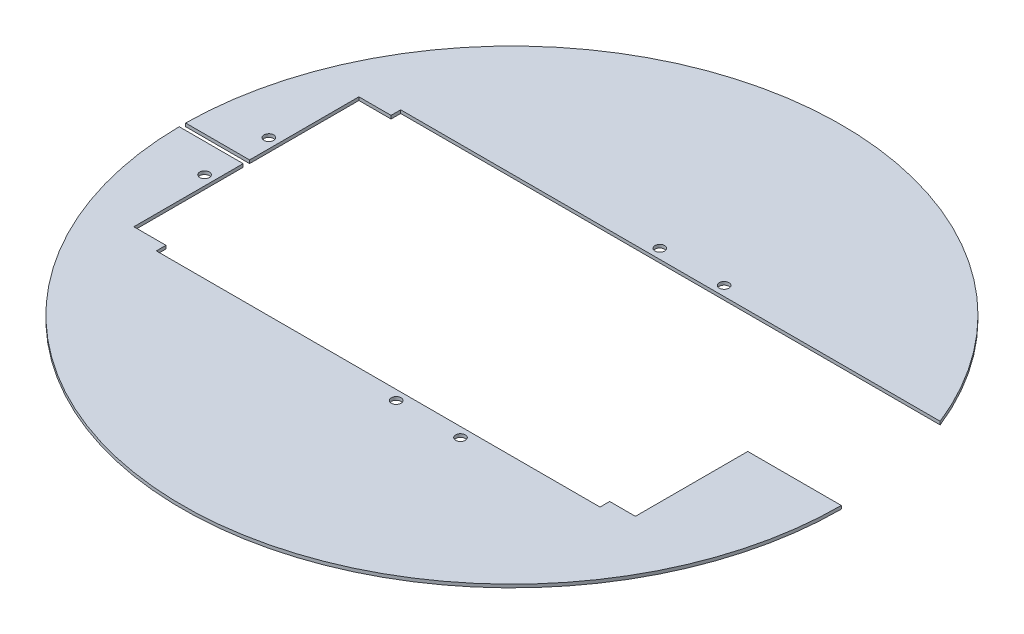
ISO-10303-21;
HEADER;
FILE_DESCRIPTION(('STEP AP214'),'2;1');
FILE_NAME('part.step','',(''),(''),'','','');
FILE_SCHEMA(('AUTOMOTIVE_DESIGN { 1 0 10303 214 1 1 1 1 }'));
ENDSEC;
DATA;
#1=APPLICATION_CONTEXT('core data for automotive mechanical design processes');
#2=APPLICATION_PROTOCOL_DEFINITION('international standard','automotive_design',2000,#1);
#3=PRODUCT_CONTEXT('',#1,'mechanical');
#4=PRODUCT('Part','Part','',(#3));
#5=PRODUCT_RELATED_PRODUCT_CATEGORY('part','',(#4));
#6=PRODUCT_DEFINITION_FORMATION('','',#4);
#7=PRODUCT_DEFINITION_CONTEXT('part definition',#1,'design');
#8=PRODUCT_DEFINITION('design','',#6,#7);
#9=PRODUCT_DEFINITION_SHAPE('','',#8);
#10=(LENGTH_UNIT() NAMED_UNIT(*) SI_UNIT(.MILLI.,.METRE.));
#11=(NAMED_UNIT(*) PLANE_ANGLE_UNIT() SI_UNIT($,.RADIAN.));
#12=(NAMED_UNIT(*) SI_UNIT($,.STERADIAN.) SOLID_ANGLE_UNIT());
#13=UNCERTAINTY_MEASURE_WITH_UNIT(LENGTH_MEASURE(1.E-05),#10,'distance_accuracy_value','');
#14=(GEOMETRIC_REPRESENTATION_CONTEXT(3) GLOBAL_UNCERTAINTY_ASSIGNED_CONTEXT((#13)) GLOBAL_UNIT_ASSIGNED_CONTEXT((#10,
#11,#12)) REPRESENTATION_CONTEXT('',''));
#15=CARTESIAN_POINT('',(0.,0.,0.));
#16=DIRECTION('',(0.,0.,1.));
#17=DIRECTION('',(1.,0.,0.));
#18=AXIS2_PLACEMENT_3D('',#15,#16,#17);
#19=CARTESIAN_POINT('',(-82.6,1.,-35.));
#20=DIRECTION('',(1.,0.,0.));
#21=DIRECTION('',(0.,0.,-1.));
#22=AXIS2_PLACEMENT_3D('',#19,#20,#21);
#23=PLANE('',#22);
#24=DIRECTION('',(0.,1.,0.));
#25=VECTOR('',#24,1.);
#26=CARTESIAN_POINT('',(-82.6,0.,1.));
#27=LINE('',#26,#25);
#28=CARTESIAN_POINT('',(-82.6,0.,1.));
#29=VERTEX_POINT('',#28);
#30=CARTESIAN_POINT('',(-82.6,1.,1.00000000000001));
#31=VERTEX_POINT('',#30);
#32=EDGE_CURVE('E78',#29,#31,#27,.T.);
#33=ORIENTED_EDGE('',*,*,#32,.T.);
#34=DIRECTION('',(0.,0.,1.));
#35=VECTOR('',#34,1.);
#36=CARTESIAN_POINT('',(-82.6,1.,-35.));
#37=LINE('',#36,#35);
#38=CARTESIAN_POINT('',(-82.6,1.,35.));
#39=VERTEX_POINT('',#38);
#40=EDGE_CURVE('E122',#31,#39,#37,.T.);
#41=ORIENTED_EDGE('',*,*,#40,.T.);
#42=DIRECTION('',(0.,-1.,0.));
#43=VECTOR('',#42,1.);
#44=CARTESIAN_POINT('',(-82.6,1.,35.));
#45=LINE('',#44,#43);
#46=CARTESIAN_POINT('',(-82.6,0.,35.));
#47=VERTEX_POINT('',#46);
#48=EDGE_CURVE('E125',#39,#47,#45,.T.);
#49=ORIENTED_EDGE('',*,*,#48,.T.);
#50=DIRECTION('',(0.,0.,1.));
#51=VECTOR('',#50,1.);
#52=CARTESIAN_POINT('',(-82.6,0.,-35.));
#53=LINE('',#52,#51);
#54=EDGE_CURVE('E50',#29,#47,#53,.T.);
#55=ORIENTED_EDGE('',*,*,#54,.F.);
#56=EDGE_LOOP('',(#33,#41,#49,#55));
#57=FACE_BOUND('',#56,.T.);
#58=ADVANCED_FACE('F46',(#57),#23,.T.);
#59=CARTESIAN_POINT('',(0.,1.,0.));
#60=DIRECTION('',(0.,1.,0.));
#61=DIRECTION('',(0.,0.,1.));
#62=AXIS2_PLACEMENT_3D('',#59,#60,#61);
#63=PLANE('',#62);
#64=CARTESIAN_POINT('',(25.,1.,41.));
#65=DIRECTION('',(0.,1.,0.));
#66=DIRECTION('',(0.,0.,1.));
#67=AXIS2_PLACEMENT_3D('',#64,#65,#66);
#68=CIRCLE('',#67,1.50000000000001);
#69=CARTESIAN_POINT('',(25.,1.,42.5));
#70=VERTEX_POINT('',#69);
#71=EDGE_CURVE('E270',#70,#70,#68,.T.);
#72=ORIENTED_EDGE('',*,*,#71,.F.);
#73=EDGE_LOOP('',(#72));
#74=FACE_BOUND('',#73,.T.);
#75=CARTESIAN_POINT('',(5.,1.,41.));
#76=DIRECTION('',(0.,1.,0.));
#77=DIRECTION('',(0.,0.,-1.));
#78=AXIS2_PLACEMENT_3D('',#75,#76,#77);
#79=CIRCLE('',#78,1.5);
#80=CARTESIAN_POINT('',(5.,1.,39.5));
#81=VERTEX_POINT('',#80);
#82=EDGE_CURVE('E261',#81,#81,#79,.T.);
#83=ORIENTED_EDGE('',*,*,#82,.F.);
#84=EDGE_LOOP('',(#83));
#85=FACE_BOUND('',#84,.T.);
#86=CARTESIAN_POINT('',(-85.6,1.,10.));
#87=DIRECTION('',(0.,1.,0.));
#88=DIRECTION('',(0.,0.,-1.));
#89=AXIS2_PLACEMENT_3D('',#86,#87,#88);
#90=CIRCLE('',#89,1.5);
#91=CARTESIAN_POINT('',(-85.6,1.,8.5));
#92=VERTEX_POINT('',#91);
#93=EDGE_CURVE('E262',#92,#92,#90,.T.);
#94=ORIENTED_EDGE('',*,*,#93,.F.);
#95=EDGE_LOOP('',(#94));
#96=FACE_BOUND('',#95,.T.);
#97=DIRECTION('',(1.,0.,0.));
#98=VECTOR('',#97,1.);
#99=CARTESIAN_POINT('',(73.4,1.,0.05));
#100=LINE('',#99,#98);
#101=CARTESIAN_POINT('',(73.4,1.,0.05));
#102=VERTEX_POINT('',#101);
#103=CARTESIAN_POINT('',(102.499987804877,1.,0.0499999999999998));
#104=VERTEX_POINT('',#103);
#105=EDGE_CURVE('E56',#102,#104,#100,.T.);
#106=ORIENTED_EDGE('',*,*,#105,.F.);
#107=DIRECTION('',(0.,0.,-1.));
#108=VECTOR('',#107,1.);
#109=CARTESIAN_POINT('',(73.4,1.,-35.));
#110=LINE('',#109,#108);
#111=CARTESIAN_POINT('',(73.4,1.,35.));
#112=VERTEX_POINT('',#111);
#113=EDGE_CURVE('E161',#112,#102,#110,.T.);
#114=ORIENTED_EDGE('',*,*,#113,.F.);
#115=DIRECTION('',(1.,0.,0.));
#116=VECTOR('',#115,1.);
#117=CARTESIAN_POINT('',(73.4,1.,35.));
#118=LINE('',#117,#116);
#119=CARTESIAN_POINT('',(65.4,1.,35.));
#120=VERTEX_POINT('',#119);
#121=EDGE_CURVE('E199',#120,#112,#118,.T.);
#122=ORIENTED_EDGE('',*,*,#121,.F.);
#123=DIRECTION('',(0.,0.,-1.));
#124=VECTOR('',#123,1.);
#125=CARTESIAN_POINT('',(65.4,1.,38.));
#126=LINE('',#125,#124);
#127=CARTESIAN_POINT('',(65.4,1.,38.));
#128=VERTEX_POINT('',#127);
#129=EDGE_CURVE('E202',#128,#120,#126,.T.);
#130=ORIENTED_EDGE('',*,*,#129,.F.);
#131=DIRECTION('',(1.,0.,0.));
#132=VECTOR('',#131,1.);
#133=CARTESIAN_POINT('',(-72.6,1.,38.));
#134=LINE('',#133,#132);
#135=CARTESIAN_POINT('',(-72.6,1.,38.));
#136=VERTEX_POINT('',#135);
#137=EDGE_CURVE('E204',#136,#128,#134,.T.);
#138=ORIENTED_EDGE('',*,*,#137,.F.);
#139=DIRECTION('',(0.,0.,1.));
#140=VECTOR('',#139,1.);
#141=CARTESIAN_POINT('',(-72.6,1.,35.));
#142=LINE('',#141,#140);
#143=CARTESIAN_POINT('',(-72.6,1.,35.));
#144=VERTEX_POINT('',#143);
#145=EDGE_CURVE('E141',#144,#136,#142,.T.);
#146=ORIENTED_EDGE('',*,*,#145,.F.);
#147=DIRECTION('',(1.,0.,0.));
#148=VECTOR('',#147,1.);
#149=CARTESIAN_POINT('',(-82.6,1.,35.));
#150=LINE('',#149,#148);
#151=EDGE_CURVE('E132',#39,#144,#150,.T.);
#152=ORIENTED_EDGE('',*,*,#151,.F.);
#153=ORIENTED_EDGE('',*,*,#40,.F.);
#154=DIRECTION('',(1.,0.,0.));
#155=VECTOR('',#154,1.);
#156=CARTESIAN_POINT('',(-82.6,1.,1.));
#157=LINE('',#156,#155);
#158=CARTESIAN_POINT('',(-102.495121835139,1.,1.));
#159=VERTEX_POINT('',#158);
#160=EDGE_CURVE('E12',#159,#31,#157,.T.);
#161=ORIENTED_EDGE('',*,*,#160,.F.);
#162=CARTESIAN_POINT('',(0.,1.,0.));
#163=DIRECTION('',(0.,1.,0.));
#164=DIRECTION('',(0.,0.,1.));
#165=AXIS2_PLACEMENT_3D('',#162,#163,#164);
#166=CIRCLE('',#165,102.5);
#167=EDGE_CURVE('E136',#159,#104,#166,.T.);
#168=ORIENTED_EDGE('',*,*,#167,.T.);
#169=EDGE_LOOP('',(#106,#114,#122,#130,#138,#146,#152,#153,#161,#168));
#170=FACE_BOUND('',#169,.T.);
#171=ADVANCED_FACE('F48',(#74,#85,#96,#170),#63,.T.);
#172=CARTESIAN_POINT('',(0.,0.,0.));
#173=DIRECTION('',(0.,1.,0.));
#174=DIRECTION('',(0.,0.,1.));
#175=AXIS2_PLACEMENT_3D('',#172,#173,#174);
#176=PLANE('',#175);
#177=CARTESIAN_POINT('',(25.,0.,41.));
#178=DIRECTION('',(0.,1.,0.));
#179=DIRECTION('',(0.,0.,1.));
#180=AXIS2_PLACEMENT_3D('',#177,#178,#179);
#181=CIRCLE('',#180,1.50000000000001);
#182=CARTESIAN_POINT('',(25.,0.,42.5));
#183=VERTEX_POINT('',#182);
#184=EDGE_CURVE('E153',#183,#183,#181,.T.);
#185=ORIENTED_EDGE('',*,*,#184,.T.);
#186=EDGE_LOOP('',(#185));
#187=FACE_BOUND('',#186,.T.);
#188=CARTESIAN_POINT('',(5.,0.,41.));
#189=DIRECTION('',(0.,1.,0.));
#190=DIRECTION('',(0.,0.,-1.));
#191=AXIS2_PLACEMENT_3D('',#188,#189,#190);
#192=CIRCLE('',#191,1.5);
#193=CARTESIAN_POINT('',(5.,0.,39.5));
#194=VERTEX_POINT('',#193);
#195=EDGE_CURVE('E256',#194,#194,#192,.T.);
#196=ORIENTED_EDGE('',*,*,#195,.T.);
#197=EDGE_LOOP('',(#196));
#198=FACE_BOUND('',#197,.T.);
#199=CARTESIAN_POINT('',(-85.6,0.,10.));
#200=DIRECTION('',(0.,1.,0.));
#201=DIRECTION('',(0.,0.,-1.));
#202=AXIS2_PLACEMENT_3D('',#199,#200,#201);
#203=CIRCLE('',#202,1.5);
#204=CARTESIAN_POINT('',(-85.6,0.,8.5));
#205=VERTEX_POINT('',#204);
#206=EDGE_CURVE('E259',#205,#205,#203,.T.);
#207=ORIENTED_EDGE('',*,*,#206,.T.);
#208=EDGE_LOOP('',(#207));
#209=FACE_BOUND('',#208,.T.);
#210=DIRECTION('',(0.,0.,-1.));
#211=VECTOR('',#210,1.);
#212=CARTESIAN_POINT('',(73.4,0.,-35.));
#213=LINE('',#212,#211);
#214=CARTESIAN_POINT('',(73.4,0.,35.));
#215=VERTEX_POINT('',#214);
#216=CARTESIAN_POINT('',(73.4,0.,0.0500000000000014));
#217=VERTEX_POINT('',#216);
#218=EDGE_CURVE('E165',#215,#217,#213,.T.);
#219=ORIENTED_EDGE('',*,*,#218,.T.);
#220=DIRECTION('',(1.,0.,0.));
#221=VECTOR('',#220,1.);
#222=CARTESIAN_POINT('',(73.4,0.,0.05));
#223=LINE('',#222,#221);
#224=CARTESIAN_POINT('',(102.499987804877,0.,0.0499999999999998));
#225=VERTEX_POINT('',#224);
#226=EDGE_CURVE('E157',#217,#225,#223,.T.);
#227=ORIENTED_EDGE('',*,*,#226,.T.);
#228=CARTESIAN_POINT('',(0.,0.,0.));
#229=DIRECTION('',(0.,1.,0.));
#230=DIRECTION('',(0.,0.,1.));
#231=AXIS2_PLACEMENT_3D('',#228,#229,#230);
#232=CIRCLE('',#231,102.5);
#233=CARTESIAN_POINT('',(-102.495121835139,0.,1.));
#234=VERTEX_POINT('',#233);
#235=EDGE_CURVE('E152',#234,#225,#232,.T.);
#236=ORIENTED_EDGE('',*,*,#235,.F.);
#237=DIRECTION('',(1.,0.,0.));
#238=VECTOR('',#237,1.);
#239=CARTESIAN_POINT('',(-82.6,0.,1.));
#240=LINE('',#239,#238);
#241=EDGE_CURVE('E155',#234,#29,#240,.T.);
#242=ORIENTED_EDGE('',*,*,#241,.T.);
#243=ORIENTED_EDGE('',*,*,#54,.T.);
#244=DIRECTION('',(1.,0.,0.));
#245=VECTOR('',#244,1.);
#246=CARTESIAN_POINT('',(-82.6,0.,35.));
#247=LINE('',#246,#245);
#248=CARTESIAN_POINT('',(-72.6,0.,35.));
#249=VERTEX_POINT('',#248);
#250=EDGE_CURVE('E135',#47,#249,#247,.T.);
#251=ORIENTED_EDGE('',*,*,#250,.T.);
#252=DIRECTION('',(0.,0.,1.));
#253=VECTOR('',#252,1.);
#254=CARTESIAN_POINT('',(-72.6,0.,35.));
#255=LINE('',#254,#253);
#256=CARTESIAN_POINT('',(-72.6,0.,38.));
#257=VERTEX_POINT('',#256);
#258=EDGE_CURVE('E192',#249,#257,#255,.T.);
#259=ORIENTED_EDGE('',*,*,#258,.T.);
#260=DIRECTION('',(1.,0.,0.));
#261=VECTOR('',#260,1.);
#262=CARTESIAN_POINT('',(-72.6,0.,38.));
#263=LINE('',#262,#261);
#264=CARTESIAN_POINT('',(65.4,0.,38.));
#265=VERTEX_POINT('',#264);
#266=EDGE_CURVE('E195',#257,#265,#263,.T.);
#267=ORIENTED_EDGE('',*,*,#266,.T.);
#268=DIRECTION('',(0.,0.,-1.));
#269=VECTOR('',#268,1.);
#270=CARTESIAN_POINT('',(65.4,0.,38.));
#271=LINE('',#270,#269);
#272=CARTESIAN_POINT('',(65.4,0.,35.));
#273=VERTEX_POINT('',#272);
#274=EDGE_CURVE('E218',#265,#273,#271,.T.);
#275=ORIENTED_EDGE('',*,*,#274,.T.);
#276=DIRECTION('',(1.,0.,0.));
#277=VECTOR('',#276,1.);
#278=CARTESIAN_POINT('',(73.4,0.,35.));
#279=LINE('',#278,#277);
#280=EDGE_CURVE('E170',#273,#215,#279,.T.);
#281=ORIENTED_EDGE('',*,*,#280,.T.);
#282=EDGE_LOOP('',(#219,#227,#236,#242,#243,#251,#259,#267,#275,#281));
#283=FACE_BOUND('',#282,.T.);
#284=ADVANCED_FACE('F177',(#187,#198,#209,#283),#176,.F.);
#285=CARTESIAN_POINT('',(0.,1.,0.));
#286=DIRECTION('',(0.,-1.,0.));
#287=DIRECTION('',(0.,0.,-1.));
#288=AXIS2_PLACEMENT_3D('',#285,#286,#287);
#289=CYLINDRICAL_SURFACE('',#288,102.5);
#290=ORIENTED_EDGE('',*,*,#235,.T.);
#291=DIRECTION('',(0.,-1.,0.));
#292=VECTOR('',#291,1.);
#293=CARTESIAN_POINT('',(102.499987804877,1.,0.0499999999999998));
#294=LINE('',#293,#292);
#295=EDGE_CURVE('E145',#225,#104,#294,.F.);
#296=ORIENTED_EDGE('',*,*,#295,.T.);
#297=ORIENTED_EDGE('',*,*,#167,.F.);
#298=DIRECTION('',(0.,-1.,0.));
#299=VECTOR('',#298,1.);
#300=CARTESIAN_POINT('',(-102.495121835139,1.,1.));
#301=LINE('',#300,#299);
#302=EDGE_CURVE('E64',#159,#234,#301,.T.);
#303=ORIENTED_EDGE('',*,*,#302,.T.);
#304=EDGE_LOOP('',(#290,#296,#297,#303));
#305=FACE_BOUND('',#304,.T.);
#306=ADVANCED_FACE('F191',(#305),#289,.T.);
#307=CARTESIAN_POINT('',(-82.6,1.,35.));
#308=DIRECTION('',(0.,0.,-1.));
#309=DIRECTION('',(-1.,0.,0.));
#310=AXIS2_PLACEMENT_3D('',#307,#308,#309);
#311=PLANE('',#310);
#312=ORIENTED_EDGE('',*,*,#250,.F.);
#313=ORIENTED_EDGE('',*,*,#48,.F.);
#314=ORIENTED_EDGE('',*,*,#151,.T.);
#315=DIRECTION('',(0.,-1.,0.));
#316=VECTOR('',#315,1.);
#317=CARTESIAN_POINT('',(-72.6,1.,35.));
#318=LINE('',#317,#316);
#319=EDGE_CURVE('E142',#144,#249,#318,.T.);
#320=ORIENTED_EDGE('',*,*,#319,.T.);
#321=EDGE_LOOP('',(#312,#313,#314,#320));
#322=FACE_BOUND('',#321,.T.);
#323=ADVANCED_FACE('F131',(#322),#311,.T.);
#324=CARTESIAN_POINT('',(-72.6,1.,35.));
#325=DIRECTION('',(1.,0.,0.));
#326=DIRECTION('',(0.,0.,-1.));
#327=AXIS2_PLACEMENT_3D('',#324,#325,#326);
#328=PLANE('',#327);
#329=ORIENTED_EDGE('',*,*,#258,.F.);
#330=ORIENTED_EDGE('',*,*,#319,.F.);
#331=ORIENTED_EDGE('',*,*,#145,.T.);
#332=DIRECTION('',(0.,-1.,0.));
#333=VECTOR('',#332,1.);
#334=CARTESIAN_POINT('',(-72.6,1.,38.));
#335=LINE('',#334,#333);
#336=EDGE_CURVE('E205',#136,#257,#335,.T.);
#337=ORIENTED_EDGE('',*,*,#336,.T.);
#338=EDGE_LOOP('',(#329,#330,#331,#337));
#339=FACE_BOUND('',#338,.T.);
#340=ADVANCED_FACE('F296',(#339),#328,.T.);
#341=CARTESIAN_POINT('',(-72.6,1.,38.));
#342=DIRECTION('',(0.,0.,-1.));
#343=DIRECTION('',(-1.,0.,0.));
#344=AXIS2_PLACEMENT_3D('',#341,#342,#343);
#345=PLANE('',#344);
#346=ORIENTED_EDGE('',*,*,#266,.F.);
#347=ORIENTED_EDGE('',*,*,#336,.F.);
#348=ORIENTED_EDGE('',*,*,#137,.T.);
#349=DIRECTION('',(0.,-1.,0.));
#350=VECTOR('',#349,1.);
#351=CARTESIAN_POINT('',(65.4,1.,38.));
#352=LINE('',#351,#350);
#353=EDGE_CURVE('E203',#128,#265,#352,.T.);
#354=ORIENTED_EDGE('',*,*,#353,.T.);
#355=EDGE_LOOP('',(#346,#347,#348,#354));
#356=FACE_BOUND('',#355,.T.);
#357=ADVANCED_FACE('F221',(#356),#345,.T.);
#358=CARTESIAN_POINT('',(65.4,1.,38.));
#359=DIRECTION('',(-1.,0.,0.));
#360=DIRECTION('',(0.,0.,1.));
#361=AXIS2_PLACEMENT_3D('',#358,#359,#360);
#362=PLANE('',#361);
#363=ORIENTED_EDGE('',*,*,#274,.F.);
#364=ORIENTED_EDGE('',*,*,#353,.F.);
#365=ORIENTED_EDGE('',*,*,#129,.T.);
#366=DIRECTION('',(0.,-1.,0.));
#367=VECTOR('',#366,1.);
#368=CARTESIAN_POINT('',(65.4,1.,35.));
#369=LINE('',#368,#367);
#370=EDGE_CURVE('E201',#120,#273,#369,.T.);
#371=ORIENTED_EDGE('',*,*,#370,.T.);
#372=EDGE_LOOP('',(#363,#364,#365,#371));
#373=FACE_BOUND('',#372,.T.);
#374=ADVANCED_FACE('F224',(#373),#362,.T.);
#375=CARTESIAN_POINT('',(73.4,1.,35.));
#376=DIRECTION('',(0.,0.,-1.));
#377=DIRECTION('',(-1.,0.,0.));
#378=AXIS2_PLACEMENT_3D('',#375,#376,#377);
#379=PLANE('',#378);
#380=ORIENTED_EDGE('',*,*,#280,.F.);
#381=ORIENTED_EDGE('',*,*,#370,.F.);
#382=ORIENTED_EDGE('',*,*,#121,.T.);
#383=DIRECTION('',(0.,-1.,0.));
#384=VECTOR('',#383,1.);
#385=CARTESIAN_POINT('',(73.4,1.,35.));
#386=LINE('',#385,#384);
#387=EDGE_CURVE('E172',#112,#215,#386,.T.);
#388=ORIENTED_EDGE('',*,*,#387,.T.);
#389=EDGE_LOOP('',(#380,#381,#382,#388));
#390=FACE_BOUND('',#389,.T.);
#391=ADVANCED_FACE('F227',(#390),#379,.T.);
#392=CARTESIAN_POINT('',(73.4,1.,-35.));
#393=DIRECTION('',(-1.,0.,0.));
#394=DIRECTION('',(0.,0.,1.));
#395=AXIS2_PLACEMENT_3D('',#392,#393,#394);
#396=PLANE('',#395);
#397=DIRECTION('',(0.,1.,0.));
#398=VECTOR('',#397,1.);
#399=CARTESIAN_POINT('',(73.4,0.,0.05));
#400=LINE('',#399,#398);
#401=EDGE_CURVE('E158',#217,#102,#400,.T.);
#402=ORIENTED_EDGE('',*,*,#401,.F.);
#403=ORIENTED_EDGE('',*,*,#218,.F.);
#404=ORIENTED_EDGE('',*,*,#387,.F.);
#405=ORIENTED_EDGE('',*,*,#113,.T.);
#406=EDGE_LOOP('',(#402,#403,#404,#405));
#407=FACE_BOUND('',#406,.T.);
#408=ADVANCED_FACE('F184',(#407),#396,.T.);
#409=CARTESIAN_POINT('',(73.4,0.,0.05));
#410=DIRECTION('',(0.,0.,1.));
#411=DIRECTION('',(1.,0.,0.));
#412=AXIS2_PLACEMENT_3D('',#409,#410,#411);
#413=PLANE('',#412);
#414=ORIENTED_EDGE('',*,*,#226,.F.);
#415=ORIENTED_EDGE('',*,*,#401,.T.);
#416=ORIENTED_EDGE('',*,*,#105,.T.);
#417=ORIENTED_EDGE('',*,*,#295,.F.);
#418=EDGE_LOOP('',(#414,#415,#416,#417));
#419=FACE_BOUND('',#418,.T.);
#420=ADVANCED_FACE('F187',(#419),#413,.F.);
#421=CARTESIAN_POINT('',(-82.6,0.,1.));
#422=DIRECTION('',(0.,0.,1.));
#423=DIRECTION('',(1.,0.,0.));
#424=AXIS2_PLACEMENT_3D('',#421,#422,#423);
#425=PLANE('',#424);
#426=ORIENTED_EDGE('',*,*,#160,.T.);
#427=ORIENTED_EDGE('',*,*,#32,.F.);
#428=ORIENTED_EDGE('',*,*,#241,.F.);
#429=ORIENTED_EDGE('',*,*,#302,.F.);
#430=EDGE_LOOP('',(#426,#427,#428,#429));
#431=FACE_BOUND('',#430,.T.);
#432=ADVANCED_FACE('F284',(#431),#425,.F.);
#433=CARTESIAN_POINT('',(-85.6,0.,10.));
#434=DIRECTION('',(0.,1.,0.));
#435=DIRECTION('',(0.,0.,1.));
#436=AXIS2_PLACEMENT_3D('',#433,#434,#435);
#437=CYLINDRICAL_SURFACE('',#436,1.5);
#438=ORIENTED_EDGE('',*,*,#206,.F.);
#439=EDGE_LOOP('',(#438));
#440=FACE_BOUND('',#439,.T.);
#441=ORIENTED_EDGE('',*,*,#93,.T.);
#442=EDGE_LOOP('',(#441));
#443=FACE_BOUND('',#442,.T.);
#444=ADVANCED_FACE('F281',(#440,#443),#437,.F.);
#445=CARTESIAN_POINT('',(5.,0.,41.));
#446=DIRECTION('',(0.,1.,0.));
#447=DIRECTION('',(0.,0.,1.));
#448=AXIS2_PLACEMENT_3D('',#445,#446,#447);
#449=CYLINDRICAL_SURFACE('',#448,1.5);
#450=ORIENTED_EDGE('',*,*,#195,.F.);
#451=EDGE_LOOP('',(#450));
#452=FACE_BOUND('',#451,.T.);
#453=ORIENTED_EDGE('',*,*,#82,.T.);
#454=EDGE_LOOP('',(#453));
#455=FACE_BOUND('',#454,.T.);
#456=ADVANCED_FACE('F283',(#452,#455),#449,.F.);
#457=CARTESIAN_POINT('',(25.,0.,41.));
#458=DIRECTION('',(0.,1.,0.));
#459=DIRECTION('',(0.,0.,1.));
#460=AXIS2_PLACEMENT_3D('',#457,#458,#459);
#461=CYLINDRICAL_SURFACE('',#460,1.50000000000001);
#462=ORIENTED_EDGE('',*,*,#184,.F.);
#463=EDGE_LOOP('',(#462));
#464=FACE_BOUND('',#463,.T.);
#465=ORIENTED_EDGE('',*,*,#71,.T.);
#466=EDGE_LOOP('',(#465));
#467=FACE_BOUND('',#466,.T.);
#468=ADVANCED_FACE('F275',(#464,#467),#461,.F.);
#469=CLOSED_SHELL('',(#58,#171,#284,#306,#323,#340,#357,#374,#391,#408,#420,#432,#444,#456,#468));
#470=MANIFOLD_SOLID_BREP('B2',#469);
#471=CARTESIAN_POINT('',(-72.6,1.,-35.));
#472=DIRECTION('',(1.,0.,0.));
#473=DIRECTION('',(0.,0.,-1.));
#474=AXIS2_PLACEMENT_3D('',#471,#472,#473);
#475=PLANE('',#474);
#476=DIRECTION('',(0.,0.,1.));
#477=VECTOR('',#476,1.);
#478=CARTESIAN_POINT('',(-72.6,0.,-35.));
#479=LINE('',#478,#477);
#480=CARTESIAN_POINT('',(-72.6,0.,-38.));
#481=VERTEX_POINT('',#480);
#482=CARTESIAN_POINT('',(-72.6,0.,-35.));
#483=VERTEX_POINT('',#482);
#484=EDGE_CURVE('E451',#481,#483,#479,.T.);
#485=ORIENTED_EDGE('',*,*,#484,.F.);
#486=DIRECTION('',(0.,-1.,0.));
#487=VECTOR('',#486,1.);
#488=CARTESIAN_POINT('',(-72.6,1.,-38.));
#489=LINE('',#488,#487);
#490=CARTESIAN_POINT('',(-72.6,1.,-38.));
#491=VERTEX_POINT('',#490);
#492=EDGE_CURVE('E446',#491,#481,#489,.T.);
#493=ORIENTED_EDGE('',*,*,#492,.F.);
#494=DIRECTION('',(0.,0.,1.));
#495=VECTOR('',#494,1.);
#496=CARTESIAN_POINT('',(-72.6,1.,-35.));
#497=LINE('',#496,#495);
#498=CARTESIAN_POINT('',(-72.6,1.,-35.));
#499=VERTEX_POINT('',#498);
#500=EDGE_CURVE('E472',#491,#499,#497,.T.);
#501=ORIENTED_EDGE('',*,*,#500,.T.);
#502=DIRECTION('',(0.,-1.,0.));
#503=VECTOR('',#502,1.);
#504=CARTESIAN_POINT('',(-72.6,1.,-35.));
#505=LINE('',#504,#503);
#506=EDGE_CURVE('E467',#499,#483,#505,.T.);
#507=ORIENTED_EDGE('',*,*,#506,.T.);
#508=EDGE_LOOP('',(#485,#493,#501,#507));
#509=FACE_BOUND('',#508,.T.);
#510=ADVANCED_FACE('F388',(#509),#475,.T.);
#511=CARTESIAN_POINT('',(-72.6,1.,-38.));
#512=DIRECTION('',(0.,0.,1.));
#513=DIRECTION('',(1.,0.,0.));
#514=AXIS2_PLACEMENT_3D('',#511,#512,#513);
#515=PLANE('',#514);
#516=DIRECTION('',(-1.,0.,0.));
#517=VECTOR('',#516,1.);
#518=CARTESIAN_POINT('',(-72.6,0.,-38.));
#519=LINE('',#518,#517);
#520=CARTESIAN_POINT('',(95.1958507499145,0.,-38.));
#521=VERTEX_POINT('',#520);
#522=EDGE_CURVE('E441',#521,#481,#519,.T.);
#523=ORIENTED_EDGE('',*,*,#522,.F.);
#524=DIRECTION('',(0.,-1.,0.));
#525=VECTOR('',#524,1.);
#526=CARTESIAN_POINT('',(95.1958507499145,1.,-38.));
#527=LINE('',#526,#525);
#528=CARTESIAN_POINT('',(95.1958507499145,1.,-38.));
#529=VERTEX_POINT('',#528);
#530=EDGE_CURVE('E444',#529,#521,#527,.T.);
#531=ORIENTED_EDGE('',*,*,#530,.F.);
#532=DIRECTION('',(-1.,0.,0.));
#533=VECTOR('',#532,1.);
#534=CARTESIAN_POINT('',(-72.6,1.,-38.));
#535=LINE('',#534,#533);
#536=EDGE_CURVE('E402',#529,#491,#535,.T.);
#537=ORIENTED_EDGE('',*,*,#536,.T.);
#538=ORIENTED_EDGE('',*,*,#492,.T.);
#539=EDGE_LOOP('',(#523,#531,#537,#538));
#540=FACE_BOUND('',#539,.T.);
#541=ADVANCED_FACE('F443',(#540),#515,.T.);
#542=CARTESIAN_POINT('',(-82.6,1.,-35.));
#543=DIRECTION('',(0.,0.,1.));
#544=DIRECTION('',(1.,0.,0.));
#545=AXIS2_PLACEMENT_3D('',#542,#543,#544);
#546=PLANE('',#545);
#547=DIRECTION('',(-1.,0.,0.));
#548=VECTOR('',#547,1.);
#549=CARTESIAN_POINT('',(-82.6,0.,-35.));
#550=LINE('',#549,#548);
#551=CARTESIAN_POINT('',(-82.6,0.,-35.));
#552=VERTEX_POINT('',#551);
#553=EDGE_CURVE('E476',#483,#552,#550,.T.);
#554=ORIENTED_EDGE('',*,*,#553,.F.);
#555=ORIENTED_EDGE('',*,*,#506,.F.);
#556=DIRECTION('',(-1.,0.,0.));
#557=VECTOR('',#556,1.);
#558=CARTESIAN_POINT('',(-82.6,1.,-35.));
#559=LINE('',#558,#557);
#560=CARTESIAN_POINT('',(-82.6,1.,-35.));
#561=VERTEX_POINT('',#560);
#562=EDGE_CURVE('E473',#499,#561,#559,.T.);
#563=ORIENTED_EDGE('',*,*,#562,.T.);
#564=DIRECTION('',(0.,-1.,0.));
#565=VECTOR('',#564,1.);
#566=CARTESIAN_POINT('',(-82.6,1.,-35.));
#567=LINE('',#566,#565);
#568=EDGE_CURVE('E461',#561,#552,#567,.T.);
#569=ORIENTED_EDGE('',*,*,#568,.T.);
#570=EDGE_LOOP('',(#554,#555,#563,#569));
#571=FACE_BOUND('',#570,.T.);
#572=ADVANCED_FACE('F545',(#571),#546,.T.);
#573=CARTESIAN_POINT('',(-82.6,1.,-35.));
#574=DIRECTION('',(1.,0.,0.));
#575=DIRECTION('',(0.,0.,-1.));
#576=AXIS2_PLACEMENT_3D('',#573,#574,#575);
#577=PLANE('',#576);
#578=DIRECTION('',(0.,1.,0.));
#579=VECTOR('',#578,1.);
#580=CARTESIAN_POINT('',(-82.6,0.,-1.));
#581=LINE('',#580,#579);
#582=CARTESIAN_POINT('',(-82.6,0.,-1.00000000000001));
#583=VERTEX_POINT('',#582);
#584=CARTESIAN_POINT('',(-82.6,1.,-1.));
#585=VERTEX_POINT('',#584);
#586=EDGE_CURVE('E486',#583,#585,#581,.T.);
#587=ORIENTED_EDGE('',*,*,#586,.F.);
#588=DIRECTION('',(0.,0.,1.));
#589=VECTOR('',#588,1.);
#590=CARTESIAN_POINT('',(-82.6,0.,-35.));
#591=LINE('',#590,#589);
#592=EDGE_CURVE('E452',#552,#583,#591,.T.);
#593=ORIENTED_EDGE('',*,*,#592,.F.);
#594=ORIENTED_EDGE('',*,*,#568,.F.);
#595=DIRECTION('',(0.,0.,1.));
#596=VECTOR('',#595,1.);
#597=CARTESIAN_POINT('',(-82.6,1.,-35.));
#598=LINE('',#597,#596);
#599=EDGE_CURVE('E481',#561,#585,#598,.T.);
#600=ORIENTED_EDGE('',*,*,#599,.T.);
#601=EDGE_LOOP('',(#587,#593,#594,#600));
#602=FACE_BOUND('',#601,.T.);
#603=ADVANCED_FACE('F548',(#602),#577,.T.);
#604=CARTESIAN_POINT('',(0.,1.,0.));
#605=DIRECTION('',(0.,-1.,0.));
#606=DIRECTION('',(0.,0.,-1.));
#607=AXIS2_PLACEMENT_3D('',#604,#605,#606);
#608=CYLINDRICAL_SURFACE('',#607,102.5);
#609=CARTESIAN_POINT('',(0.,1.,0.));
#610=DIRECTION('',(0.,1.,0.));
#611=DIRECTION('',(0.,0.,1.));
#612=AXIS2_PLACEMENT_3D('',#609,#610,#611);
#613=CIRCLE('',#612,102.5);
#614=CARTESIAN_POINT('',(-102.495121835139,1.,-1.));
#615=VERTEX_POINT('',#614);
#616=EDGE_CURVE('E44',#529,#615,#613,.T.);
#617=ORIENTED_EDGE('',*,*,#616,.F.);
#618=ORIENTED_EDGE('',*,*,#530,.T.);
#619=CARTESIAN_POINT('',(0.,0.,0.));
#620=DIRECTION('',(0.,1.,0.));
#621=DIRECTION('',(0.,0.,1.));
#622=AXIS2_PLACEMENT_3D('',#619,#620,#621);
#623=CIRCLE('',#622,102.5);
#624=CARTESIAN_POINT('',(-102.495121835139,0.,-1.));
#625=VERTEX_POINT('',#624);
#626=EDGE_CURVE('E392',#521,#625,#623,.T.);
#627=ORIENTED_EDGE('',*,*,#626,.T.);
#628=DIRECTION('',(0.,-1.,0.));
#629=VECTOR('',#628,1.);
#630=CARTESIAN_POINT('',(-102.495121835139,1.,-1.));
#631=LINE('',#630,#629);
#632=EDGE_CURVE('E478',#625,#615,#631,.F.);
#633=ORIENTED_EDGE('',*,*,#632,.T.);
#634=EDGE_LOOP('',(#617,#618,#627,#633));
#635=FACE_BOUND('',#634,.T.);
#636=ADVANCED_FACE('F390',(#635),#608,.T.);
#637=CARTESIAN_POINT('',(0.,0.,0.));
#638=DIRECTION('',(0.,1.,0.));
#639=DIRECTION('',(0.,0.,1.));
#640=AXIS2_PLACEMENT_3D('',#637,#638,#639);
#641=PLANE('',#640);
#642=CARTESIAN_POINT('',(5.,0.,-41.));
#643=DIRECTION('',(0.,1.,0.));
#644=DIRECTION('',(0.,0.,1.));
#645=AXIS2_PLACEMENT_3D('',#642,#643,#644);
#646=CIRCLE('',#645,1.5);
#647=CARTESIAN_POINT('',(5.,0.,-39.5));
#648=VERTEX_POINT('',#647);
#649=EDGE_CURVE('E457',#648,#648,#646,.T.);
#650=ORIENTED_EDGE('',*,*,#649,.T.);
#651=EDGE_LOOP('',(#650));
#652=FACE_BOUND('',#651,.T.);
#653=CARTESIAN_POINT('',(25.,0.,-41.));
#654=DIRECTION('',(0.,1.,0.));
#655=DIRECTION('',(0.,0.,-1.));
#656=AXIS2_PLACEMENT_3D('',#653,#654,#655);
#657=CIRCLE('',#656,1.50000000000001);
#658=CARTESIAN_POINT('',(25.,0.,-42.5));
#659=VERTEX_POINT('',#658);
#660=EDGE_CURVE('E500',#659,#659,#657,.T.);
#661=ORIENTED_EDGE('',*,*,#660,.T.);
#662=EDGE_LOOP('',(#661));
#663=FACE_BOUND('',#662,.T.);
#664=CARTESIAN_POINT('',(-85.6,0.,-10.));
#665=DIRECTION('',(0.,1.,0.));
#666=DIRECTION('',(0.,0.,1.));
#667=AXIS2_PLACEMENT_3D('',#664,#665,#666);
#668=CIRCLE('',#667,1.5);
#669=CARTESIAN_POINT('',(-85.6,0.,-8.5));
#670=VERTEX_POINT('',#669);
#671=EDGE_CURVE('E494',#670,#670,#668,.T.);
#672=ORIENTED_EDGE('',*,*,#671,.T.);
#673=EDGE_LOOP('',(#672));
#674=FACE_BOUND('',#673,.T.);
#675=ORIENTED_EDGE('',*,*,#626,.F.);
#676=ORIENTED_EDGE('',*,*,#522,.T.);
#677=ORIENTED_EDGE('',*,*,#484,.T.);
#678=ORIENTED_EDGE('',*,*,#553,.T.);
#679=ORIENTED_EDGE('',*,*,#592,.T.);
#680=DIRECTION('',(-1.,0.,0.));
#681=VECTOR('',#680,1.);
#682=CARTESIAN_POINT('',(-82.6,0.,-1.));
#683=LINE('',#682,#681);
#684=EDGE_CURVE('E410',#583,#625,#683,.T.);
#685=ORIENTED_EDGE('',*,*,#684,.T.);
#686=EDGE_LOOP('',(#675,#676,#677,#678,#679,#685));
#687=FACE_BOUND('',#686,.T.);
#688=ADVANCED_FACE('F459',(#652,#663,#674,#687),#641,.F.);
#689=CARTESIAN_POINT('',(0.,1.,0.));
#690=DIRECTION('',(0.,1.,0.));
#691=DIRECTION('',(0.,0.,1.));
#692=AXIS2_PLACEMENT_3D('',#689,#690,#691);
#693=PLANE('',#692);
#694=CARTESIAN_POINT('',(5.,1.,-41.));
#695=DIRECTION('',(0.,1.,0.));
#696=DIRECTION('',(0.,0.,1.));
#697=AXIS2_PLACEMENT_3D('',#694,#695,#696);
#698=CIRCLE('',#697,1.5);
#699=CARTESIAN_POINT('',(5.,1.,-39.5));
#700=VERTEX_POINT('',#699);
#701=EDGE_CURVE('E503',#700,#700,#698,.T.);
#702=ORIENTED_EDGE('',*,*,#701,.F.);
#703=EDGE_LOOP('',(#702));
#704=FACE_BOUND('',#703,.T.);
#705=CARTESIAN_POINT('',(25.,1.,-41.));
#706=DIRECTION('',(0.,1.,0.));
#707=DIRECTION('',(0.,0.,-1.));
#708=AXIS2_PLACEMENT_3D('',#705,#706,#707);
#709=CIRCLE('',#708,1.50000000000001);
#710=CARTESIAN_POINT('',(25.,1.,-42.5));
#711=VERTEX_POINT('',#710);
#712=EDGE_CURVE('E497',#711,#711,#709,.T.);
#713=ORIENTED_EDGE('',*,*,#712,.F.);
#714=EDGE_LOOP('',(#713));
#715=FACE_BOUND('',#714,.T.);
#716=CARTESIAN_POINT('',(-85.6,1.,-10.));
#717=DIRECTION('',(0.,1.,0.));
#718=DIRECTION('',(0.,0.,1.));
#719=AXIS2_PLACEMENT_3D('',#716,#717,#718);
#720=CIRCLE('',#719,1.5);
#721=CARTESIAN_POINT('',(-85.6,1.,-8.5));
#722=VERTEX_POINT('',#721);
#723=EDGE_CURVE('E491',#722,#722,#720,.T.);
#724=ORIENTED_EDGE('',*,*,#723,.F.);
#725=EDGE_LOOP('',(#724));
#726=FACE_BOUND('',#725,.T.);
#727=ORIENTED_EDGE('',*,*,#536,.F.);
#728=ORIENTED_EDGE('',*,*,#616,.T.);
#729=DIRECTION('',(-1.,0.,0.));
#730=VECTOR('',#729,1.);
#731=CARTESIAN_POINT('',(-82.6,1.,-1.));
#732=LINE('',#731,#730);
#733=EDGE_CURVE('E456',#585,#615,#732,.T.);
#734=ORIENTED_EDGE('',*,*,#733,.F.);
#735=ORIENTED_EDGE('',*,*,#599,.F.);
#736=ORIENTED_EDGE('',*,*,#562,.F.);
#737=ORIENTED_EDGE('',*,*,#500,.F.);
#738=EDGE_LOOP('',(#727,#728,#734,#735,#736,#737));
#739=FACE_BOUND('',#738,.T.);
#740=ADVANCED_FACE('F518',(#704,#715,#726,#739),#693,.T.);
#741=CARTESIAN_POINT('',(-82.6,0.,-1.));
#742=DIRECTION('',(0.,0.,-1.));
#743=DIRECTION('',(-1.,0.,0.));
#744=AXIS2_PLACEMENT_3D('',#741,#742,#743);
#745=PLANE('',#744);
#746=ORIENTED_EDGE('',*,*,#684,.F.);
#747=ORIENTED_EDGE('',*,*,#586,.T.);
#748=ORIENTED_EDGE('',*,*,#733,.T.);
#749=ORIENTED_EDGE('',*,*,#632,.F.);
#750=EDGE_LOOP('',(#746,#747,#748,#749));
#751=FACE_BOUND('',#750,.T.);
#752=ADVANCED_FACE('F521',(#751),#745,.F.);
#753=CARTESIAN_POINT('',(-85.6,0.,-10.));
#754=DIRECTION('',(0.,1.,0.));
#755=DIRECTION('',(0.,0.,1.));
#756=AXIS2_PLACEMENT_3D('',#753,#754,#755);
#757=CYLINDRICAL_SURFACE('',#756,1.5);
#758=ORIENTED_EDGE('',*,*,#671,.F.);
#759=EDGE_LOOP('',(#758));
#760=FACE_BOUND('',#759,.T.);
#761=ORIENTED_EDGE('',*,*,#723,.T.);
#762=EDGE_LOOP('',(#761));
#763=FACE_BOUND('',#762,.T.);
#764=ADVANCED_FACE('F527',(#760,#763),#757,.F.);
#765=CARTESIAN_POINT('',(25.,0.,-41.));
#766=DIRECTION('',(0.,1.,0.));
#767=DIRECTION('',(0.,0.,1.));
#768=AXIS2_PLACEMENT_3D('',#765,#766,#767);
#769=CYLINDRICAL_SURFACE('',#768,1.50000000000001);
#770=ORIENTED_EDGE('',*,*,#660,.F.);
#771=EDGE_LOOP('',(#770));
#772=FACE_BOUND('',#771,.T.);
#773=ORIENTED_EDGE('',*,*,#712,.T.);
#774=EDGE_LOOP('',(#773));
#775=FACE_BOUND('',#774,.T.);
#776=ADVANCED_FACE('F514',(#772,#775),#769,.F.);
#777=CARTESIAN_POINT('',(5.,0.,-41.));
#778=DIRECTION('',(0.,1.,0.));
#779=DIRECTION('',(0.,0.,1.));
#780=AXIS2_PLACEMENT_3D('',#777,#778,#779);
#781=CYLINDRICAL_SURFACE('',#780,1.5);
#782=ORIENTED_EDGE('',*,*,#649,.F.);
#783=EDGE_LOOP('',(#782));
#784=FACE_BOUND('',#783,.T.);
#785=ORIENTED_EDGE('',*,*,#701,.T.);
#786=EDGE_LOOP('',(#785));
#787=FACE_BOUND('',#786,.T.);
#788=ADVANCED_FACE('F511',(#784,#787),#781,.F.);
#789=CLOSED_SHELL('',(#510,#541,#572,#603,#636,#688,#740,#752,#764,#776,#788));
#790=MANIFOLD_SOLID_BREP('B6',#789);
#791=ADVANCED_BREP_SHAPE_REPRESENTATION('',(#18,#470,#790),#14);
#792=SHAPE_DEFINITION_REPRESENTATION(#9,#791);
ENDSEC;
END-ISO-10303-21;
